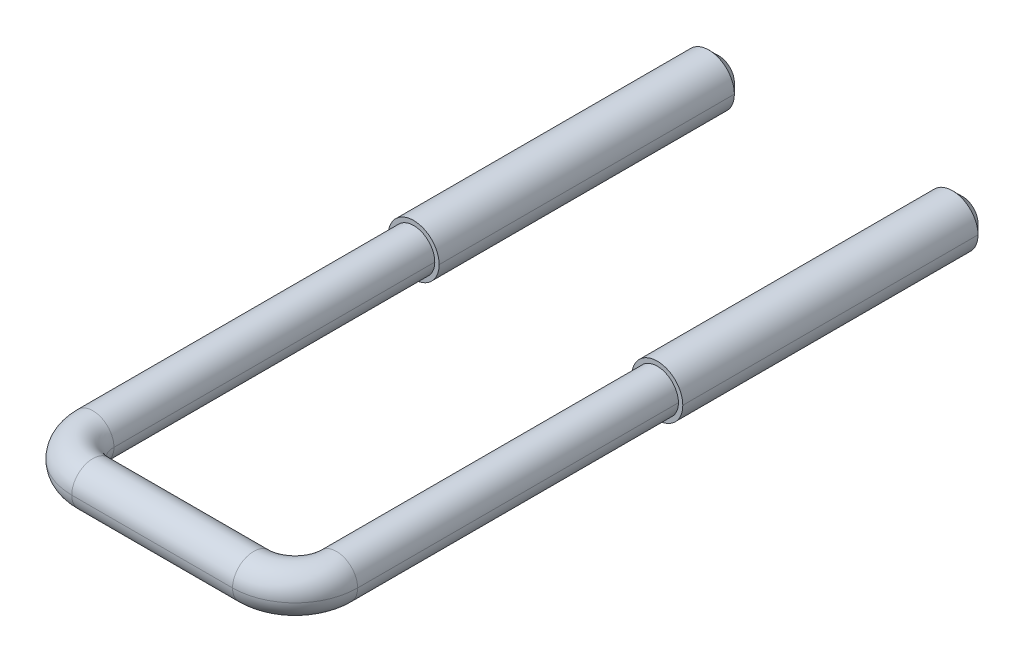
ISO-10303-21;
HEADER;
FILE_DESCRIPTION(('STEP AP214'),'2;1');
FILE_NAME('part.step','',(''),(''),'','','');
FILE_SCHEMA(('AUTOMOTIVE_DESIGN { 1 0 10303 214 1 1 1 1 }'));
ENDSEC;
DATA;
#1=APPLICATION_CONTEXT('core data for automotive mechanical design processes');
#2=APPLICATION_PROTOCOL_DEFINITION('international standard','automotive_design',2000,#1);
#3=PRODUCT_CONTEXT('',#1,'mechanical');
#4=PRODUCT('Part','Part','',(#3));
#5=PRODUCT_RELATED_PRODUCT_CATEGORY('part','',(#4));
#6=PRODUCT_DEFINITION_FORMATION('','',#4);
#7=PRODUCT_DEFINITION_CONTEXT('part definition',#1,'design');
#8=PRODUCT_DEFINITION('design','',#6,#7);
#9=PRODUCT_DEFINITION_SHAPE('','',#8);
#10=(LENGTH_UNIT() NAMED_UNIT(*) SI_UNIT(.MILLI.,.METRE.));
#11=(NAMED_UNIT(*) PLANE_ANGLE_UNIT() SI_UNIT($,.RADIAN.));
#12=(NAMED_UNIT(*) SI_UNIT($,.STERADIAN.) SOLID_ANGLE_UNIT());
#13=UNCERTAINTY_MEASURE_WITH_UNIT(LENGTH_MEASURE(1.E-05),#10,'distance_accuracy_value','');
#14=(GEOMETRIC_REPRESENTATION_CONTEXT(3) GLOBAL_UNCERTAINTY_ASSIGNED_CONTEXT((#13)) GLOBAL_UNIT_ASSIGNED_CONTEXT((#10,
#11,#12)) REPRESENTATION_CONTEXT('',''));
#15=CARTESIAN_POINT('',(0.,0.,0.));
#16=DIRECTION('',(0.,0.,1.));
#17=DIRECTION('',(1.,0.,0.));
#18=AXIS2_PLACEMENT_3D('',#15,#16,#17);
#19=CARTESIAN_POINT('',(-9.525,0.,-3.23849999999999));
#20=DIRECTION('',(0.,0.,-1.));
#21=DIRECTION('',(-1.,0.,0.));
#22=AXIS2_PLACEMENT_3D('',#19,#20,#21);
#23=CYLINDRICAL_SURFACE('',#22,1.651);
#24=CARTESIAN_POINT('',(-9.525,0.,-3.2385));
#25=DIRECTION('',(0.,0.,1.));
#26=DIRECTION('',(-1.,0.,0.));
#27=AXIS2_PLACEMENT_3D('',#24,#25,#26);
#28=CIRCLE('',#27,1.651);
#29=CARTESIAN_POINT('',(-11.176,0.,-3.2385));
#30=VERTEX_POINT('',#29);
#31=CARTESIAN_POINT('',(-7.874,0.,-3.2385));
#32=VERTEX_POINT('',#31);
#33=EDGE_CURVE('E127',#30,#32,#28,.T.);
#34=ORIENTED_EDGE('',*,*,#33,.F.);
#35=DIRECTION('',(0.,0.,1.));
#36=VECTOR('',#35,1.);
#37=CARTESIAN_POINT('',(-11.176,0.,-28.321));
#38=LINE('',#37,#36);
#39=CARTESIAN_POINT('',(-11.176,0.,-28.321));
#40=VERTEX_POINT('',#39);
#41=EDGE_CURVE('E219',#40,#30,#38,.T.);
#42=ORIENTED_EDGE('',*,*,#41,.F.);
#43=CARTESIAN_POINT('',(-9.525,0.,-28.321));
#44=DIRECTION('',(0.,0.,-1.));
#45=DIRECTION('',(1.,0.,0.));
#46=AXIS2_PLACEMENT_3D('',#43,#44,#45);
#47=CIRCLE('',#46,1.651);
#48=CARTESIAN_POINT('',(-7.874,0.,-28.321));
#49=VERTEX_POINT('',#48);
#50=EDGE_CURVE('E223',#49,#40,#47,.T.);
#51=ORIENTED_EDGE('',*,*,#50,.F.);
#52=DIRECTION('',(0.,0.,1.));
#53=VECTOR('',#52,1.);
#54=CARTESIAN_POINT('',(-7.874,0.,-28.321));
#55=LINE('',#54,#53);
#56=EDGE_CURVE('E20',#49,#32,#55,.T.);
#57=ORIENTED_EDGE('',*,*,#56,.T.);
#58=EDGE_LOOP('',(#34,#42,#51,#57));
#59=FACE_BOUND('',#58,.T.);
#60=ADVANCED_FACE('F17',(#59),#23,.T.);
#61=CARTESIAN_POINT('',(9.525,0.,-52.2468131020956));
#62=DIRECTION('',(0.,0.,1.));
#63=DIRECTION('',(-1.,0.,0.));
#64=AXIS2_PLACEMENT_3D('',#61,#62,#63);
#65=CONICAL_SURFACE('',#64,1.1503368979044,0.785398163397448);
#66=CARTESIAN_POINT('',(9.525,0.,-52.197));
#67=DIRECTION('',(0.,0.,-1.));
#68=DIRECTION('',(-1.,0.,0.));
#69=AXIS2_PLACEMENT_3D('',#66,#67,#68);
#70=CIRCLE('',#69,1.20014999999997);
#71=CARTESIAN_POINT('',(8.32485000000002,0.,-52.197));
#72=VERTEX_POINT('',#71);
#73=CARTESIAN_POINT('',(10.72515,0.,-52.197));
#74=VERTEX_POINT('',#73);
#75=EDGE_CURVE('E11',#72,#74,#70,.T.);
#76=ORIENTED_EDGE('',*,*,#75,.F.);
#77=DIRECTION('',(0.707106781186547,0.,-0.707106781186547));
#78=VECTOR('',#77,1.);
#79=CARTESIAN_POINT('',(7.53110000000001,0.,-51.40325));
#80=LINE('',#79,#78);
#81=CARTESIAN_POINT('',(7.53110000000002,0.,-51.40325));
#82=VERTEX_POINT('',#81);
#83=EDGE_CURVE('E179',#82,#72,#80,.T.);
#84=ORIENTED_EDGE('',*,*,#83,.F.);
#85=CARTESIAN_POINT('',(9.525,0.,-51.40325));
#86=DIRECTION('',(0.,0.,-1.));
#87=DIRECTION('',(-1.,0.,0.));
#88=AXIS2_PLACEMENT_3D('',#85,#86,#87);
#89=CIRCLE('',#88,1.99389999999999);
#90=CARTESIAN_POINT('',(11.5189,0.,-51.40325));
#91=VERTEX_POINT('',#90);
#92=EDGE_CURVE('E41',#82,#91,#89,.T.);
#93=ORIENTED_EDGE('',*,*,#92,.T.);
#94=DIRECTION('',(-0.707106781186547,0.,-0.707106781186547));
#95=VECTOR('',#94,1.);
#96=CARTESIAN_POINT('',(11.5189,0.,-51.40325));
#97=LINE('',#96,#95);
#98=EDGE_CURVE('E25',#91,#74,#97,.T.);
#99=ORIENTED_EDGE('',*,*,#98,.T.);
#100=EDGE_LOOP('',(#76,#84,#93,#99));
#101=FACE_BOUND('',#100,.T.);
#102=ADVANCED_FACE('F190',(#101),#65,.T.);
#103=CARTESIAN_POINT('',(10.72515,0.,-52.197));
#104=DIRECTION('',(0.,0.,1.));
#105=DIRECTION('',(-1.,0.,0.));
#106=AXIS2_PLACEMENT_3D('',#103,#104,#105);
#107=PLANE('',#106);
#108=CARTESIAN_POINT('',(9.525,0.,-52.197));
#109=DIRECTION('',(0.,0.,-1.));
#110=DIRECTION('',(1.,0.,0.));
#111=AXIS2_PLACEMENT_3D('',#108,#109,#110);
#112=CIRCLE('',#111,1.20014999999997);
#113=EDGE_CURVE('E185',#74,#72,#112,.T.);
#114=ORIENTED_EDGE('',*,*,#113,.T.);
#115=ORIENTED_EDGE('',*,*,#75,.T.);
#116=EDGE_LOOP('',(#114,#115));
#117=FACE_BOUND('',#116,.T.);
#118=ADVANCED_FACE('F195',(#117),#107,.F.);
#119=CARTESIAN_POINT('',(9.525,0.,-52.2468131020956));
#120=DIRECTION('',(0.,0.,1.));
#121=DIRECTION('',(-1.,0.,0.));
#122=AXIS2_PLACEMENT_3D('',#119,#120,#121);
#123=CONICAL_SURFACE('',#122,1.1503368979044,0.785398163397448);
#124=ORIENTED_EDGE('',*,*,#98,.F.);
#125=CARTESIAN_POINT('',(9.525,0.,-51.40325));
#126=DIRECTION('',(0.,0.,-1.));
#127=DIRECTION('',(1.,0.,0.));
#128=AXIS2_PLACEMENT_3D('',#125,#126,#127);
#129=CIRCLE('',#128,1.99389999999999);
#130=EDGE_CURVE('E181',#91,#82,#129,.T.);
#131=ORIENTED_EDGE('',*,*,#130,.T.);
#132=ORIENTED_EDGE('',*,*,#83,.T.);
#133=ORIENTED_EDGE('',*,*,#113,.F.);
#134=EDGE_LOOP('',(#124,#131,#132,#133));
#135=FACE_BOUND('',#134,.T.);
#136=ADVANCED_FACE('F193',(#135),#123,.T.);
#137=CARTESIAN_POINT('',(9.525,0.,-28.321));
#138=DIRECTION('',(0.,0.,1.));
#139=DIRECTION('',(-1.,0.,0.));
#140=AXIS2_PLACEMENT_3D('',#137,#138,#139);
#141=CYLINDRICAL_SURFACE('',#140,1.99389999999998);
#142=DIRECTION('',(0.,0.,-1.));
#143=VECTOR('',#142,1.);
#144=CARTESIAN_POINT('',(11.5189,0.,-28.321));
#145=LINE('',#144,#143);
#146=CARTESIAN_POINT('',(11.5189,0.,-28.321));
#147=VERTEX_POINT('',#146);
#148=EDGE_CURVE('E168',#147,#91,#145,.T.);
#149=ORIENTED_EDGE('',*,*,#148,.F.);
#150=CARTESIAN_POINT('',(9.525,0.,-28.321));
#151=DIRECTION('',(0.,0.,1.));
#152=DIRECTION('',(-1.,0.,0.));
#153=AXIS2_PLACEMENT_3D('',#150,#151,#152);
#154=CIRCLE('',#153,1.99389999999998);
#155=CARTESIAN_POINT('',(7.53110000000002,0.,-28.321));
#156=VERTEX_POINT('',#155);
#157=EDGE_CURVE('E170',#156,#147,#154,.T.);
#158=ORIENTED_EDGE('',*,*,#157,.F.);
#159=DIRECTION('',(0.,0.,-1.));
#160=VECTOR('',#159,1.);
#161=CARTESIAN_POINT('',(7.53110000000002,0.,-28.321));
#162=LINE('',#161,#160);
#163=EDGE_CURVE('E175',#156,#82,#162,.T.);
#164=ORIENTED_EDGE('',*,*,#163,.T.);
#165=ORIENTED_EDGE('',*,*,#130,.F.);
#166=EDGE_LOOP('',(#149,#158,#164,#165));
#167=FACE_BOUND('',#166,.T.);
#168=ADVANCED_FACE('F198',(#167),#141,.T.);
#169=CARTESIAN_POINT('',(9.525,0.,-28.321));
#170=DIRECTION('',(0.,0.,1.));
#171=DIRECTION('',(-1.,0.,0.));
#172=AXIS2_PLACEMENT_3D('',#169,#170,#171);
#173=CYLINDRICAL_SURFACE('',#172,1.99389999999998);
#174=ORIENTED_EDGE('',*,*,#92,.F.);
#175=ORIENTED_EDGE('',*,*,#163,.F.);
#176=CARTESIAN_POINT('',(9.525,0.,-28.321));
#177=DIRECTION('',(0.,0.,1.));
#178=DIRECTION('',(1.,0.,0.));
#179=AXIS2_PLACEMENT_3D('',#176,#177,#178);
#180=CIRCLE('',#179,1.99389999999998);
#181=EDGE_CURVE('E163',#147,#156,#180,.T.);
#182=ORIENTED_EDGE('',*,*,#181,.F.);
#183=ORIENTED_EDGE('',*,*,#148,.T.);
#184=EDGE_LOOP('',(#174,#175,#182,#183));
#185=FACE_BOUND('',#184,.T.);
#186=ADVANCED_FACE('F200',(#185),#173,.T.);
#187=CARTESIAN_POINT('',(9.525,0.,-28.321));
#188=DIRECTION('',(0.,0.,-1.));
#189=DIRECTION('',(1.,0.,0.));
#190=AXIS2_PLACEMENT_3D('',#187,#188,#189);
#191=PLANE('',#190);
#192=CARTESIAN_POINT('',(9.525,0.,-28.321));
#193=DIRECTION('',(0.,0.,-1.));
#194=DIRECTION('',(1.,0.,0.));
#195=AXIS2_PLACEMENT_3D('',#192,#193,#194);
#196=CIRCLE('',#195,1.651);
#197=CARTESIAN_POINT('',(11.176,0.,-28.321));
#198=VERTEX_POINT('',#197);
#199=CARTESIAN_POINT('',(7.874,0.,-28.321));
#200=VERTEX_POINT('',#199);
#201=EDGE_CURVE('E159',#198,#200,#196,.T.);
#202=ORIENTED_EDGE('',*,*,#201,.T.);
#203=CARTESIAN_POINT('',(9.525,0.,-28.321));
#204=DIRECTION('',(0.,0.,-1.));
#205=DIRECTION('',(-1.,0.,0.));
#206=AXIS2_PLACEMENT_3D('',#203,#204,#205);
#207=CIRCLE('',#206,1.651);
#208=EDGE_CURVE('E162',#200,#198,#207,.T.);
#209=ORIENTED_EDGE('',*,*,#208,.T.);
#210=EDGE_LOOP('',(#202,#209));
#211=FACE_BOUND('',#210,.T.);
#212=ORIENTED_EDGE('',*,*,#157,.T.);
#213=ORIENTED_EDGE('',*,*,#181,.T.);
#214=EDGE_LOOP('',(#212,#213));
#215=FACE_BOUND('',#214,.T.);
#216=ADVANCED_FACE('F203',(#211,#215),#191,.F.);
#217=CARTESIAN_POINT('',(9.525,0.,-3.2385));
#218=DIRECTION('',(0.,0.,-1.));
#219=DIRECTION('',(-1.,0.,0.));
#220=AXIS2_PLACEMENT_3D('',#217,#218,#219);
#221=CYLINDRICAL_SURFACE('',#220,1.651);
#222=DIRECTION('',(0.,0.,1.));
#223=VECTOR('',#222,1.);
#224=CARTESIAN_POINT('',(11.176,0.,-28.321));
#225=LINE('',#224,#223);
#226=CARTESIAN_POINT('',(11.176,0.,-3.2385));
#227=VERTEX_POINT('',#226);
#228=EDGE_CURVE('E160',#198,#227,#225,.T.);
#229=ORIENTED_EDGE('',*,*,#228,.F.);
#230=ORIENTED_EDGE('',*,*,#208,.F.);
#231=DIRECTION('',(0.,0.,1.));
#232=VECTOR('',#231,1.);
#233=CARTESIAN_POINT('',(7.874,0.,-28.321));
#234=LINE('',#233,#232);
#235=CARTESIAN_POINT('',(7.87400000000001,0.,-3.2385));
#236=VERTEX_POINT('',#235);
#237=EDGE_CURVE('E161',#200,#236,#234,.T.);
#238=ORIENTED_EDGE('',*,*,#237,.T.);
#239=CARTESIAN_POINT('',(9.52500000000001,0.,-3.2385));
#240=DIRECTION('',(0.,0.,1.));
#241=DIRECTION('',(1.,0.,0.));
#242=AXIS2_PLACEMENT_3D('',#239,#240,#241);
#243=CIRCLE('',#242,1.651);
#244=EDGE_CURVE('E31',#227,#236,#243,.T.);
#245=ORIENTED_EDGE('',*,*,#244,.F.);
#246=EDGE_LOOP('',(#229,#230,#238,#245));
#247=FACE_BOUND('',#246,.T.);
#248=ADVANCED_FACE('F201',(#247),#221,.T.);
#249=CARTESIAN_POINT('',(9.525,0.,-3.2385));
#250=DIRECTION('',(0.,0.,-1.));
#251=DIRECTION('',(-1.,0.,0.));
#252=AXIS2_PLACEMENT_3D('',#249,#250,#251);
#253=CYLINDRICAL_SURFACE('',#252,1.651);
#254=CARTESIAN_POINT('',(9.52500000000001,0.,-3.23850000000001));
#255=DIRECTION('',(0.,0.,1.));
#256=DIRECTION('',(-1.,0.,0.));
#257=AXIS2_PLACEMENT_3D('',#254,#255,#256);
#258=CIRCLE('',#257,1.651);
#259=EDGE_CURVE('E152',#236,#227,#258,.T.);
#260=ORIENTED_EDGE('',*,*,#259,.F.);
#261=ORIENTED_EDGE('',*,*,#237,.F.);
#262=ORIENTED_EDGE('',*,*,#201,.F.);
#263=ORIENTED_EDGE('',*,*,#228,.T.);
#264=EDGE_LOOP('',(#260,#261,#262,#263));
#265=FACE_BOUND('',#264,.T.);
#266=ADVANCED_FACE('F211',(#265),#253,.T.);
#267=CARTESIAN_POINT('',(6.2865,0.,-3.2385));
#268=DIRECTION('',(0.,1.,0.));
#269=DIRECTION('',(0.,0.,1.));
#270=AXIS2_PLACEMENT_3D('',#267,#268,#269);
#271=TOROIDAL_SURFACE('',#270,3.23850000000001,1.651);
#272=CARTESIAN_POINT('',(6.2865,0.,0.));
#273=DIRECTION('',(1.,0.,0.));
#274=DIRECTION('',(0.,0.,1.));
#275=AXIS2_PLACEMENT_3D('',#272,#273,#274);
#276=CIRCLE('',#275,1.651);
#277=CARTESIAN_POINT('',(6.28650000000001,0.,1.65100000000001));
#278=VERTEX_POINT('',#277);
#279=CARTESIAN_POINT('',(6.28650000000001,0.,-1.65099999999999));
#280=VERTEX_POINT('',#279);
#281=EDGE_CURVE('E118',#278,#280,#276,.T.);
#282=ORIENTED_EDGE('',*,*,#281,.T.);
#283=CARTESIAN_POINT('',(6.2865,0.,-3.2385));
#284=DIRECTION('',(0.,-1.,0.));
#285=DIRECTION('',(1.,0.,0.));
#286=AXIS2_PLACEMENT_3D('',#283,#284,#285);
#287=CIRCLE('',#286,1.58750000000001);
#288=EDGE_CURVE('E146',#236,#280,#287,.T.);
#289=ORIENTED_EDGE('',*,*,#288,.F.);
#290=ORIENTED_EDGE('',*,*,#259,.T.);
#291=CARTESIAN_POINT('',(6.2865,0.,-3.2385));
#292=DIRECTION('',(0.,-1.,0.));
#293=DIRECTION('',(1.,0.,0.));
#294=AXIS2_PLACEMENT_3D('',#291,#292,#293);
#295=CIRCLE('',#294,4.88950000000001);
#296=EDGE_CURVE('E155',#227,#278,#295,.T.);
#297=ORIENTED_EDGE('',*,*,#296,.T.);
#298=EDGE_LOOP('',(#282,#289,#290,#297));
#299=FACE_BOUND('',#298,.T.);
#300=ADVANCED_FACE('F303',(#299),#271,.T.);
#301=CARTESIAN_POINT('',(6.2865,0.,-3.2385));
#302=DIRECTION('',(0.,1.,0.));
#303=DIRECTION('',(0.,0.,1.));
#304=AXIS2_PLACEMENT_3D('',#301,#302,#303);
#305=TOROIDAL_SURFACE('',#304,3.23850000000001,1.651);
#306=ORIENTED_EDGE('',*,*,#296,.F.);
#307=ORIENTED_EDGE('',*,*,#244,.T.);
#308=ORIENTED_EDGE('',*,*,#288,.T.);
#309=CARTESIAN_POINT('',(6.2865,0.,0.));
#310=DIRECTION('',(1.,0.,0.));
#311=DIRECTION('',(0.,0.,-1.));
#312=AXIS2_PLACEMENT_3D('',#309,#310,#311);
#313=CIRCLE('',#312,1.651);
#314=EDGE_CURVE('E116',#280,#278,#313,.T.);
#315=ORIENTED_EDGE('',*,*,#314,.T.);
#316=EDGE_LOOP('',(#306,#307,#308,#315));
#317=FACE_BOUND('',#316,.T.);
#318=ADVANCED_FACE('F299',(#317),#305,.T.);
#319=CARTESIAN_POINT('',(-6.2865,0.,0.));
#320=DIRECTION('',(1.,0.,0.));
#321=DIRECTION('',(0.,0.,-1.));
#322=AXIS2_PLACEMENT_3D('',#319,#320,#321);
#323=CYLINDRICAL_SURFACE('',#322,1.651);
#324=DIRECTION('',(-1.,0.,0.));
#325=VECTOR('',#324,1.);
#326=CARTESIAN_POINT('',(6.28650000000002,0.,1.65100000000001));
#327=LINE('',#326,#325);
#328=CARTESIAN_POINT('',(-6.2865,0.,1.651));
#329=VERTEX_POINT('',#328);
#330=EDGE_CURVE('E123',#278,#329,#327,.T.);
#331=ORIENTED_EDGE('',*,*,#330,.F.);
#332=ORIENTED_EDGE('',*,*,#314,.F.);
#333=DIRECTION('',(-1.,0.,0.));
#334=VECTOR('',#333,1.);
#335=CARTESIAN_POINT('',(6.28650000000003,0.,-1.65099999999999));
#336=LINE('',#335,#334);
#337=CARTESIAN_POINT('',(-6.2865,0.,-1.651));
#338=VERTEX_POINT('',#337);
#339=EDGE_CURVE('E107',#280,#338,#336,.T.);
#340=ORIENTED_EDGE('',*,*,#339,.T.);
#341=CARTESIAN_POINT('',(-6.2865,0.,0.));
#342=DIRECTION('',(-1.,0.,0.));
#343=DIRECTION('',(0.,0.,1.));
#344=AXIS2_PLACEMENT_3D('',#341,#342,#343);
#345=CIRCLE('',#344,1.651);
#346=EDGE_CURVE('E114',#329,#338,#345,.T.);
#347=ORIENTED_EDGE('',*,*,#346,.F.);
#348=EDGE_LOOP('',(#331,#332,#340,#347));
#349=FACE_BOUND('',#348,.T.);
#350=ADVANCED_FACE('F112',(#349),#323,.T.);
#351=CARTESIAN_POINT('',(-6.2865,0.,0.));
#352=DIRECTION('',(1.,0.,0.));
#353=DIRECTION('',(0.,0.,-1.));
#354=AXIS2_PLACEMENT_3D('',#351,#352,#353);
#355=CYLINDRICAL_SURFACE('',#354,1.651);
#356=CARTESIAN_POINT('',(-6.2865,0.,0.));
#357=DIRECTION('',(-1.,0.,0.));
#358=DIRECTION('',(0.,0.,-1.));
#359=AXIS2_PLACEMENT_3D('',#356,#357,#358);
#360=CIRCLE('',#359,1.651);
#361=EDGE_CURVE('E125',#338,#329,#360,.T.);
#362=ORIENTED_EDGE('',*,*,#361,.F.);
#363=ORIENTED_EDGE('',*,*,#339,.F.);
#364=ORIENTED_EDGE('',*,*,#281,.F.);
#365=ORIENTED_EDGE('',*,*,#330,.T.);
#366=EDGE_LOOP('',(#362,#363,#364,#365));
#367=FACE_BOUND('',#366,.T.);
#368=ADVANCED_FACE('F121',(#367),#355,.T.);
#369=CARTESIAN_POINT('',(-6.2865,0.,-3.2385));
#370=DIRECTION('',(0.,1.,0.));
#371=DIRECTION('',(0.,0.,1.));
#372=AXIS2_PLACEMENT_3D('',#369,#370,#371);
#373=TOROIDAL_SURFACE('',#372,3.2385,1.651);
#374=ORIENTED_EDGE('',*,*,#33,.T.);
#375=CARTESIAN_POINT('',(-6.2865,0.,-3.2385));
#376=DIRECTION('',(0.,-1.,0.));
#377=DIRECTION('',(0.,0.,1.));
#378=AXIS2_PLACEMENT_3D('',#375,#376,#377);
#379=CIRCLE('',#378,1.5875);
#380=EDGE_CURVE('E133',#338,#32,#379,.T.);
#381=ORIENTED_EDGE('',*,*,#380,.F.);
#382=ORIENTED_EDGE('',*,*,#361,.T.);
#383=CARTESIAN_POINT('',(-6.2865,0.,-3.2385));
#384=DIRECTION('',(0.,-1.,0.));
#385=DIRECTION('',(0.,0.,1.));
#386=AXIS2_PLACEMENT_3D('',#383,#384,#385);
#387=CIRCLE('',#386,4.8895);
#388=EDGE_CURVE('E129',#329,#30,#387,.T.);
#389=ORIENTED_EDGE('',*,*,#388,.T.);
#390=EDGE_LOOP('',(#374,#381,#382,#389));
#391=FACE_BOUND('',#390,.T.);
#392=ADVANCED_FACE('F134',(#391),#373,.T.);
#393=CARTESIAN_POINT('',(-6.2865,0.,-3.2385));
#394=DIRECTION('',(0.,1.,0.));
#395=DIRECTION('',(0.,0.,1.));
#396=AXIS2_PLACEMENT_3D('',#393,#394,#395);
#397=TOROIDAL_SURFACE('',#396,3.2385,1.651);
#398=ORIENTED_EDGE('',*,*,#388,.F.);
#399=ORIENTED_EDGE('',*,*,#346,.T.);
#400=ORIENTED_EDGE('',*,*,#380,.T.);
#401=CARTESIAN_POINT('',(-9.525,0.,-3.2385));
#402=DIRECTION('',(0.,0.,1.));
#403=DIRECTION('',(1.,0.,0.));
#404=AXIS2_PLACEMENT_3D('',#401,#402,#403);
#405=CIRCLE('',#404,1.651);
#406=EDGE_CURVE('E224',#32,#30,#405,.T.);
#407=ORIENTED_EDGE('',*,*,#406,.T.);
#408=EDGE_LOOP('',(#398,#399,#400,#407));
#409=FACE_BOUND('',#408,.T.);
#410=ADVANCED_FACE('F139',(#409),#397,.T.);
#411=CARTESIAN_POINT('',(-9.525,0.,-3.23849999999999));
#412=DIRECTION('',(0.,0.,-1.));
#413=DIRECTION('',(-1.,0.,0.));
#414=AXIS2_PLACEMENT_3D('',#411,#412,#413);
#415=CYLINDRICAL_SURFACE('',#414,1.651);
#416=ORIENTED_EDGE('',*,*,#56,.F.);
#417=CARTESIAN_POINT('',(-9.525,0.,-28.321));
#418=DIRECTION('',(0.,0.,-1.));
#419=DIRECTION('',(-1.,0.,0.));
#420=AXIS2_PLACEMENT_3D('',#417,#418,#419);
#421=CIRCLE('',#420,1.651);
#422=EDGE_CURVE('E229',#40,#49,#421,.T.);
#423=ORIENTED_EDGE('',*,*,#422,.F.);
#424=ORIENTED_EDGE('',*,*,#41,.T.);
#425=ORIENTED_EDGE('',*,*,#406,.F.);
#426=EDGE_LOOP('',(#416,#423,#424,#425));
#427=FACE_BOUND('',#426,.T.);
#428=ADVANCED_FACE('F226',(#427),#415,.T.);
#429=CARTESIAN_POINT('',(-9.525,0.,-28.321));
#430=DIRECTION('',(0.,0.,-1.));
#431=DIRECTION('',(-1.,0.,0.));
#432=AXIS2_PLACEMENT_3D('',#429,#430,#431);
#433=PLANE('',#432);
#434=ORIENTED_EDGE('',*,*,#50,.T.);
#435=ORIENTED_EDGE('',*,*,#422,.T.);
#436=EDGE_LOOP('',(#434,#435));
#437=FACE_BOUND('',#436,.T.);
#438=CARTESIAN_POINT('',(-9.525,0.,-28.321));
#439=DIRECTION('',(0.,0.,1.));
#440=DIRECTION('',(-1.,0.,0.));
#441=AXIS2_PLACEMENT_3D('',#438,#439,#440);
#442=CIRCLE('',#441,1.99389999999998);
#443=CARTESIAN_POINT('',(-11.5189,0.,-28.321));
#444=VERTEX_POINT('',#443);
#445=CARTESIAN_POINT('',(-7.53110000000002,0.,-28.321));
#446=VERTEX_POINT('',#445);
#447=EDGE_CURVE('E233',#444,#446,#442,.T.);
#448=ORIENTED_EDGE('',*,*,#447,.T.);
#449=CARTESIAN_POINT('',(-9.525,0.,-28.321));
#450=DIRECTION('',(0.,0.,1.));
#451=DIRECTION('',(1.,0.,0.));
#452=AXIS2_PLACEMENT_3D('',#449,#450,#451);
#453=CIRCLE('',#452,1.99389999999998);
#454=EDGE_CURVE('E231',#446,#444,#453,.T.);
#455=ORIENTED_EDGE('',*,*,#454,.T.);
#456=EDGE_LOOP('',(#448,#455));
#457=FACE_BOUND('',#456,.T.);
#458=ADVANCED_FACE('F285',(#437,#457),#433,.F.);
#459=CARTESIAN_POINT('',(-9.525,0.,-28.321));
#460=DIRECTION('',(0.,0.,1.));
#461=DIRECTION('',(1.,0.,0.));
#462=AXIS2_PLACEMENT_3D('',#459,#460,#461);
#463=CYLINDRICAL_SURFACE('',#462,1.99389999999998);
#464=DIRECTION('',(0.,0.,-1.));
#465=VECTOR('',#464,1.);
#466=CARTESIAN_POINT('',(-11.5189,0.,-28.321));
#467=LINE('',#466,#465);
#468=CARTESIAN_POINT('',(-11.5189,0.,-51.40325));
#469=VERTEX_POINT('',#468);
#470=EDGE_CURVE('E238',#444,#469,#467,.T.);
#471=ORIENTED_EDGE('',*,*,#470,.F.);
#472=ORIENTED_EDGE('',*,*,#454,.F.);
#473=DIRECTION('',(0.,0.,-1.));
#474=VECTOR('',#473,1.);
#475=CARTESIAN_POINT('',(-7.53110000000002,0.,-28.321));
#476=LINE('',#475,#474);
#477=CARTESIAN_POINT('',(-7.53110000000002,0.,-51.40325));
#478=VERTEX_POINT('',#477);
#479=EDGE_CURVE('E236',#446,#478,#476,.T.);
#480=ORIENTED_EDGE('',*,*,#479,.T.);
#481=CARTESIAN_POINT('',(-9.525,0.,-51.40325));
#482=DIRECTION('',(0.,0.,-1.));
#483=DIRECTION('',(-1.,0.,0.));
#484=AXIS2_PLACEMENT_3D('',#481,#482,#483);
#485=CIRCLE('',#484,1.99389999999998);
#486=EDGE_CURVE('E247',#469,#478,#485,.T.);
#487=ORIENTED_EDGE('',*,*,#486,.F.);
#488=EDGE_LOOP('',(#471,#472,#480,#487));
#489=FACE_BOUND('',#488,.T.);
#490=ADVANCED_FACE('F281',(#489),#463,.T.);
#491=CARTESIAN_POINT('',(-9.525,0.,-28.321));
#492=DIRECTION('',(0.,0.,1.));
#493=DIRECTION('',(1.,0.,0.));
#494=AXIS2_PLACEMENT_3D('',#491,#492,#493);
#495=CYLINDRICAL_SURFACE('',#494,1.99389999999998);
#496=CARTESIAN_POINT('',(-9.525,0.,-51.40325));
#497=DIRECTION('',(0.,0.,-1.));
#498=DIRECTION('',(1.,0.,0.));
#499=AXIS2_PLACEMENT_3D('',#496,#497,#498);
#500=CIRCLE('',#499,1.99389999999999);
#501=EDGE_CURVE('E242',#478,#469,#500,.T.);
#502=ORIENTED_EDGE('',*,*,#501,.F.);
#503=ORIENTED_EDGE('',*,*,#479,.F.);
#504=ORIENTED_EDGE('',*,*,#447,.F.);
#505=ORIENTED_EDGE('',*,*,#470,.T.);
#506=EDGE_LOOP('',(#502,#503,#504,#505));
#507=FACE_BOUND('',#506,.T.);
#508=ADVANCED_FACE('F277',(#507),#495,.T.);
#509=CARTESIAN_POINT('',(-9.525,0.,-52.2468131020956));
#510=DIRECTION('',(0.,0.,1.));
#511=DIRECTION('',(1.,0.,0.));
#512=AXIS2_PLACEMENT_3D('',#509,#510,#511);
#513=CONICAL_SURFACE('',#512,1.1503368979044,0.785398163397448);
#514=CARTESIAN_POINT('',(-9.525,0.,-52.197));
#515=DIRECTION('',(0.,0.,-1.));
#516=DIRECTION('',(1.,0.,0.));
#517=AXIS2_PLACEMENT_3D('',#514,#515,#516);
#518=CIRCLE('',#517,1.20014999999997);
#519=CARTESIAN_POINT('',(-8.32485000000002,0.,-52.197));
#520=VERTEX_POINT('',#519);
#521=CARTESIAN_POINT('',(-10.72515,0.,-52.197));
#522=VERTEX_POINT('',#521);
#523=EDGE_CURVE('E246',#520,#522,#518,.T.);
#524=ORIENTED_EDGE('',*,*,#523,.F.);
#525=DIRECTION('',(-0.707106781186547,0.,-0.707106781186547));
#526=VECTOR('',#525,1.);
#527=CARTESIAN_POINT('',(-7.53110000000001,0.,-51.40325));
#528=LINE('',#527,#526);
#529=EDGE_CURVE('E254',#478,#520,#528,.T.);
#530=ORIENTED_EDGE('',*,*,#529,.F.);
#531=ORIENTED_EDGE('',*,*,#501,.T.);
#532=DIRECTION('',(0.707106781186547,0.,-0.707106781186547));
#533=VECTOR('',#532,1.);
#534=CARTESIAN_POINT('',(-11.5189,0.,-51.40325));
#535=LINE('',#534,#533);
#536=EDGE_CURVE('E250',#469,#522,#535,.T.);
#537=ORIENTED_EDGE('',*,*,#536,.T.);
#538=EDGE_LOOP('',(#524,#530,#531,#537));
#539=FACE_BOUND('',#538,.T.);
#540=ADVANCED_FACE('F264',(#539),#513,.T.);
#541=CARTESIAN_POINT('',(-10.72515,0.,-52.197));
#542=DIRECTION('',(0.,0.,1.));
#543=DIRECTION('',(1.,0.,0.));
#544=AXIS2_PLACEMENT_3D('',#541,#542,#543);
#545=PLANE('',#544);
#546=ORIENTED_EDGE('',*,*,#523,.T.);
#547=CARTESIAN_POINT('',(-9.525,0.,-52.197));
#548=DIRECTION('',(0.,0.,-1.));
#549=DIRECTION('',(-1.,0.,0.));
#550=AXIS2_PLACEMENT_3D('',#547,#548,#549);
#551=CIRCLE('',#550,1.20014999999997);
#552=EDGE_CURVE('E252',#522,#520,#551,.T.);
#553=ORIENTED_EDGE('',*,*,#552,.T.);
#554=EDGE_LOOP('',(#546,#553));
#555=FACE_BOUND('',#554,.T.);
#556=ADVANCED_FACE('F268',(#555),#545,.F.);
#557=CARTESIAN_POINT('',(-9.525,0.,-52.2468131020956));
#558=DIRECTION('',(0.,0.,1.));
#559=DIRECTION('',(1.,0.,0.));
#560=AXIS2_PLACEMENT_3D('',#557,#558,#559);
#561=CONICAL_SURFACE('',#560,1.1503368979044,0.785398163397448);
#562=ORIENTED_EDGE('',*,*,#536,.F.);
#563=ORIENTED_EDGE('',*,*,#486,.T.);
#564=ORIENTED_EDGE('',*,*,#529,.T.);
#565=ORIENTED_EDGE('',*,*,#552,.F.);
#566=EDGE_LOOP('',(#562,#563,#564,#565));
#567=FACE_BOUND('',#566,.T.);
#568=ADVANCED_FACE('F263',(#567),#561,.T.);
#569=CLOSED_SHELL('',(#60,#102,#118,#136,#168,#186,#216,#248,#266,#300,#318,#350,#368,#392,#410,
#428,#458,#490,#508,#540,#556,#568));
#570=MANIFOLD_SOLID_BREP('B1',#569);
#571=ADVANCED_BREP_SHAPE_REPRESENTATION('',(#18,#570),#14);
#572=SHAPE_DEFINITION_REPRESENTATION(#9,#571);
ENDSEC;
END-ISO-10303-21;
